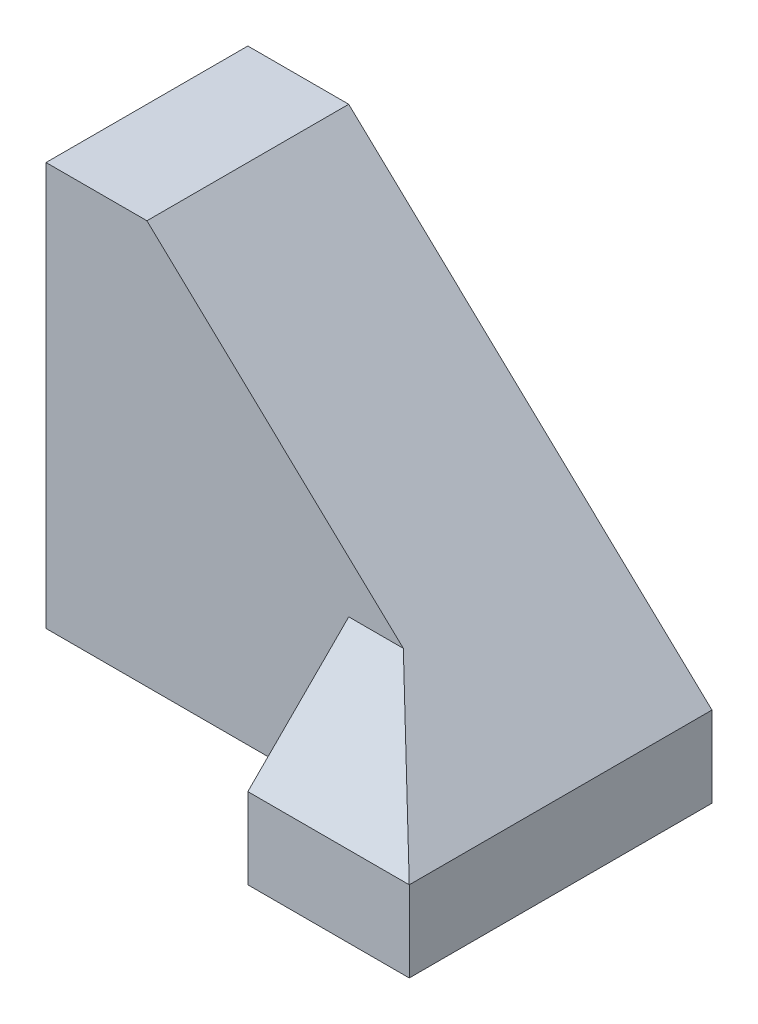
ISO-10303-21;
HEADER;
FILE_DESCRIPTION(('STEP AP214'),'2;1');
FILE_NAME('part.step','',(''),(''),'','','');
FILE_SCHEMA(('AUTOMOTIVE_DESIGN { 1 0 10303 214 1 1 1 1 }'));
ENDSEC;
DATA;
#1=APPLICATION_CONTEXT('core data for automotive mechanical design processes');
#2=APPLICATION_PROTOCOL_DEFINITION('international standard','automotive_design',2000,#1);
#3=PRODUCT_CONTEXT('',#1,'mechanical');
#4=PRODUCT('Part','Part','',(#3));
#5=PRODUCT_RELATED_PRODUCT_CATEGORY('part','',(#4));
#6=PRODUCT_DEFINITION_FORMATION('','',#4);
#7=PRODUCT_DEFINITION_CONTEXT('part definition',#1,'design');
#8=PRODUCT_DEFINITION('design','',#6,#7);
#9=PRODUCT_DEFINITION_SHAPE('','',#8);
#10=(LENGTH_UNIT() NAMED_UNIT(*) SI_UNIT(.MILLI.,.METRE.));
#11=(NAMED_UNIT(*) PLANE_ANGLE_UNIT() SI_UNIT($,.RADIAN.));
#12=(NAMED_UNIT(*) SI_UNIT($,.STERADIAN.) SOLID_ANGLE_UNIT());
#13=UNCERTAINTY_MEASURE_WITH_UNIT(LENGTH_MEASURE(1.E-05),#10,'distance_accuracy_value','');
#14=(GEOMETRIC_REPRESENTATION_CONTEXT(3) GLOBAL_UNCERTAINTY_ASSIGNED_CONTEXT((#13)) GLOBAL_UNIT_ASSIGNED_CONTEXT((#10,
#11,#12)) REPRESENTATION_CONTEXT('',''));
#15=CARTESIAN_POINT('',(0.,0.,0.));
#16=DIRECTION('',(0.,0.,1.));
#17=DIRECTION('',(1.,0.,0.));
#18=AXIS2_PLACEMENT_3D('',#15,#16,#17);
#19=CARTESIAN_POINT('',(23.,0.,10.));
#20=DIRECTION('',(0.,1.,0.));
#21=DIRECTION('',(-1.,0.,0.));
#22=AXIS2_PLACEMENT_3D('',#19,#20,#21);
#23=PLANE('',#22);
#24=DIRECTION('',(0.,0.,-1.));
#25=VECTOR('',#24,1.);
#26=CARTESIAN_POINT('',(15.,0.,15.));
#27=LINE('',#26,#25);
#28=CARTESIAN_POINT('',(15.,0.,10.));
#29=VERTEX_POINT('',#28);
#30=CARTESIAN_POINT('',(15.,0.,0.));
#31=VERTEX_POINT('',#30);
#32=EDGE_CURVE('E11',#29,#31,#27,.T.);
#33=ORIENTED_EDGE('',*,*,#32,.F.);
#34=DIRECTION('',(1.,0.,0.));
#35=VECTOR('',#34,1.);
#36=CARTESIAN_POINT('',(23.,0.,10.));
#37=LINE('',#36,#35);
#38=CARTESIAN_POINT('',(0.,0.,10.));
#39=VERTEX_POINT('',#38);
#40=EDGE_CURVE('E152',#39,#29,#37,.T.);
#41=ORIENTED_EDGE('',*,*,#40,.F.);
#42=DIRECTION('',(0.,0.,-1.));
#43=VECTOR('',#42,1.);
#44=CARTESIAN_POINT('',(0.,0.,10.));
#45=LINE('',#44,#43);
#46=CARTESIAN_POINT('',(0.,0.,0.));
#47=VERTEX_POINT('',#46);
#48=EDGE_CURVE('E161',#39,#47,#45,.T.);
#49=ORIENTED_EDGE('',*,*,#48,.T.);
#50=DIRECTION('',(1.,0.,0.));
#51=VECTOR('',#50,1.);
#52=CARTESIAN_POINT('',(23.,0.,0.));
#53=LINE('',#52,#51);
#54=EDGE_CURVE('E143',#47,#31,#53,.T.);
#55=ORIENTED_EDGE('',*,*,#54,.T.);
#56=EDGE_LOOP('',(#33,#41,#49,#55));
#57=FACE_BOUND('',#56,.T.);
#58=ADVANCED_FACE('F34',(#57),#23,.F.);
#59=CARTESIAN_POINT('',(0.,0.,10.));
#60=DIRECTION('',(0.,0.,-1.));
#61=DIRECTION('',(-1.,0.,0.));
#62=AXIS2_PLACEMENT_3D('',#59,#60,#61);
#63=PLANE('',#62);
#64=DIRECTION('',(0.,-1.,0.));
#65=VECTOR('',#64,1.);
#66=CARTESIAN_POINT('',(15.,0.,10.));
#67=LINE('',#66,#65);
#68=CARTESIAN_POINT('',(15.,8.00000000000004,10.));
#69=VERTEX_POINT('',#68);
#70=EDGE_CURVE('E59',#69,#29,#67,.T.);
#71=ORIENTED_EDGE('',*,*,#70,.F.);
#72=DIRECTION('',(1.,0.,0.));
#73=VECTOR('',#72,1.);
#74=CARTESIAN_POINT('',(23.,8.00000000000004,10.));
#75=LINE('',#74,#73);
#76=CARTESIAN_POINT('',(17.7058823529411,8.00000000000004,10.));
#77=VERTEX_POINT('',#76);
#78=EDGE_CURVE('E178',#69,#77,#75,.T.);
#79=ORIENTED_EDGE('',*,*,#78,.T.);
#80=DIRECTION('',(-0.727013152549817,0.686623532963716,0.));
#81=VECTOR('',#80,1.);
#82=CARTESIAN_POINT('',(5.,20.,10.));
#83=LINE('',#82,#81);
#84=CARTESIAN_POINT('',(5.,20.,10.));
#85=VERTEX_POINT('',#84);
#86=EDGE_CURVE('E154',#77,#85,#83,.T.);
#87=ORIENTED_EDGE('',*,*,#86,.T.);
#88=DIRECTION('',(-1.,0.,0.));
#89=VECTOR('',#88,1.);
#90=CARTESIAN_POINT('',(0.,20.,10.));
#91=LINE('',#90,#89);
#92=CARTESIAN_POINT('',(0.,20.,10.));
#93=VERTEX_POINT('',#92);
#94=EDGE_CURVE('E157',#85,#93,#91,.T.);
#95=ORIENTED_EDGE('',*,*,#94,.T.);
#96=DIRECTION('',(0.,-1.,0.));
#97=VECTOR('',#96,1.);
#98=CARTESIAN_POINT('',(0.,0.,10.));
#99=LINE('',#98,#97);
#100=EDGE_CURVE('E159',#93,#39,#99,.T.);
#101=ORIENTED_EDGE('',*,*,#100,.T.);
#102=ORIENTED_EDGE('',*,*,#40,.T.);
#103=EDGE_LOOP('',(#71,#79,#87,#95,#101,#102));
#104=FACE_BOUND('',#103,.T.);
#105=ADVANCED_FACE('F194',(#104),#63,.F.);
#106=CARTESIAN_POINT('',(23.,3.,10.));
#107=DIRECTION('',(-1.,0.,0.));
#108=DIRECTION('',(0.,0.,1.));
#109=AXIS2_PLACEMENT_3D('',#106,#107,#108);
#110=PLANE('',#109);
#111=DIRECTION('',(0.,1.,0.));
#112=VECTOR('',#111,1.);
#113=CARTESIAN_POINT('',(23.,3.,0.));
#114=LINE('',#113,#112);
#115=CARTESIAN_POINT('',(23.,-1.,0.));
#116=VERTEX_POINT('',#115);
#117=CARTESIAN_POINT('',(23.,3.,0.));
#118=VERTEX_POINT('',#117);
#119=EDGE_CURVE('E112',#116,#118,#114,.T.);
#120=ORIENTED_EDGE('',*,*,#119,.T.);
#121=DIRECTION('',(0.,0.,-1.));
#122=VECTOR('',#121,1.);
#123=CARTESIAN_POINT('',(23.,3.,10.));
#124=LINE('',#123,#122);
#125=CARTESIAN_POINT('',(23.,3.,15.));
#126=VERTEX_POINT('',#125);
#127=EDGE_CURVE('E51',#126,#118,#124,.T.);
#128=ORIENTED_EDGE('',*,*,#127,.F.);
#129=DIRECTION('',(0.,1.,0.));
#130=VECTOR('',#129,1.);
#131=CARTESIAN_POINT('',(23.,0.,15.));
#132=LINE('',#131,#130);
#133=CARTESIAN_POINT('',(23.,-1.,15.));
#134=VERTEX_POINT('',#133);
#135=EDGE_CURVE('E134',#134,#126,#132,.T.);
#136=ORIENTED_EDGE('',*,*,#135,.F.);
#137=DIRECTION('',(0.,0.,1.));
#138=VECTOR('',#137,1.);
#139=CARTESIAN_POINT('',(23.,-1.,15.));
#140=LINE('',#139,#138);
#141=EDGE_CURVE('E116',#116,#134,#140,.T.);
#142=ORIENTED_EDGE('',*,*,#141,.F.);
#143=EDGE_LOOP('',(#120,#128,#136,#142));
#144=FACE_BOUND('',#143,.T.);
#145=ADVANCED_FACE('F191',(#144),#110,.F.);
#146=CARTESIAN_POINT('',(5.,20.,10.));
#147=DIRECTION('',(-0.686623532963717,-0.727013152549817,0.));
#148=DIRECTION('',(0.727013152549817,-0.686623532963717,0.));
#149=AXIS2_PLACEMENT_3D('',#146,#147,#148);
#150=PLANE('',#149);
#151=DIRECTION('',(-0.727013152549817,0.686623532963716,0.));
#152=VECTOR('',#151,1.);
#153=CARTESIAN_POINT('',(5.,20.,0.));
#154=LINE('',#153,#152);
#155=CARTESIAN_POINT('',(5.,20.,0.));
#156=VERTEX_POINT('',#155);
#157=EDGE_CURVE('E164',#118,#156,#154,.T.);
#158=ORIENTED_EDGE('',*,*,#157,.T.);
#159=DIRECTION('',(0.,0.,-1.));
#160=VECTOR('',#159,1.);
#161=CARTESIAN_POINT('',(5.,20.,10.));
#162=LINE('',#161,#160);
#163=EDGE_CURVE('E174',#85,#156,#162,.T.);
#164=ORIENTED_EDGE('',*,*,#163,.F.);
#165=ORIENTED_EDGE('',*,*,#86,.F.);
#166=DIRECTION('',(-0.599334442390825,0.566038084480224,-0.56603808448022));
#167=VECTOR('',#166,1.);
#168=CARTESIAN_POINT('',(9.07095343680704,16.1552106430156,1.84478935698452));
#169=LINE('',#168,#167);
#170=EDGE_CURVE('E39',#77,#126,#169,.F.);
#171=ORIENTED_EDGE('',*,*,#170,.T.);
#172=ORIENTED_EDGE('',*,*,#127,.T.);
#173=EDGE_LOOP('',(#158,#164,#165,#171,#172));
#174=FACE_BOUND('',#173,.T.);
#175=ADVANCED_FACE('F186',(#174),#150,.F.);
#176=CARTESIAN_POINT('',(0.,20.,10.));
#177=DIRECTION('',(0.,-1.,0.));
#178=DIRECTION('',(0.,0.,-1.));
#179=AXIS2_PLACEMENT_3D('',#176,#177,#178);
#180=PLANE('',#179);
#181=DIRECTION('',(-1.,0.,0.));
#182=VECTOR('',#181,1.);
#183=CARTESIAN_POINT('',(0.,20.,0.));
#184=LINE('',#183,#182);
#185=CARTESIAN_POINT('',(0.,20.,0.));
#186=VERTEX_POINT('',#185);
#187=EDGE_CURVE('E166',#156,#186,#184,.T.);
#188=ORIENTED_EDGE('',*,*,#187,.T.);
#189=DIRECTION('',(0.,0.,-1.));
#190=VECTOR('',#189,1.);
#191=CARTESIAN_POINT('',(0.,20.,10.));
#192=LINE('',#191,#190);
#193=EDGE_CURVE('E171',#93,#186,#192,.T.);
#194=ORIENTED_EDGE('',*,*,#193,.F.);
#195=ORIENTED_EDGE('',*,*,#94,.F.);
#196=ORIENTED_EDGE('',*,*,#163,.T.);
#197=EDGE_LOOP('',(#188,#194,#195,#196));
#198=FACE_BOUND('',#197,.T.);
#199=ADVANCED_FACE('F200',(#198),#180,.F.);
#200=CARTESIAN_POINT('',(0.,0.,10.));
#201=DIRECTION('',(1.,0.,0.));
#202=DIRECTION('',(0.,0.,-1.));
#203=AXIS2_PLACEMENT_3D('',#200,#201,#202);
#204=PLANE('',#203);
#205=CARTESIAN_POINT('',(0.,15.,5.));
#206=DIRECTION('',(-1.,0.,0.));
#207=DIRECTION('',(0.,0.,1.));
#208=AXIS2_PLACEMENT_3D('',#205,#206,#207);
#209=CIRCLE('',#208,1.85);
#210=CARTESIAN_POINT('',(0.,15.,6.85));
#211=VERTEX_POINT('',#210);
#212=EDGE_CURVE('E144',#211,#211,#209,.T.);
#213=ORIENTED_EDGE('',*,*,#212,.F.);
#214=EDGE_LOOP('',(#213));
#215=FACE_BOUND('',#214,.T.);
#216=CARTESIAN_POINT('',(0.,5.,5.));
#217=DIRECTION('',(-1.,0.,0.));
#218=DIRECTION('',(0.,0.,1.));
#219=AXIS2_PLACEMENT_3D('',#216,#217,#218);
#220=CIRCLE('',#219,1.85);
#221=CARTESIAN_POINT('',(0.,5.,6.85));
#222=VERTEX_POINT('',#221);
#223=EDGE_CURVE('E138',#222,#222,#220,.T.);
#224=ORIENTED_EDGE('',*,*,#223,.F.);
#225=EDGE_LOOP('',(#224));
#226=FACE_BOUND('',#225,.T.);
#227=DIRECTION('',(0.,-1.,0.));
#228=VECTOR('',#227,1.);
#229=CARTESIAN_POINT('',(0.,0.,0.));
#230=LINE('',#229,#228);
#231=EDGE_CURVE('E155',#186,#47,#230,.T.);
#232=ORIENTED_EDGE('',*,*,#231,.T.);
#233=ORIENTED_EDGE('',*,*,#48,.F.);
#234=ORIENTED_EDGE('',*,*,#100,.F.);
#235=ORIENTED_EDGE('',*,*,#193,.T.);
#236=EDGE_LOOP('',(#232,#233,#234,#235));
#237=FACE_BOUND('',#236,.T.);
#238=ADVANCED_FACE('F213',(#215,#226,#237),#204,.F.);
#239=CARTESIAN_POINT('',(0.,0.,0.));
#240=DIRECTION('',(0.,0.,-1.));
#241=DIRECTION('',(-1.,0.,0.));
#242=AXIS2_PLACEMENT_3D('',#239,#240,#241);
#243=PLANE('',#242);
#244=ORIENTED_EDGE('',*,*,#54,.F.);
#245=ORIENTED_EDGE('',*,*,#231,.F.);
#246=ORIENTED_EDGE('',*,*,#187,.F.);
#247=ORIENTED_EDGE('',*,*,#157,.F.);
#248=ORIENTED_EDGE('',*,*,#119,.F.);
#249=DIRECTION('',(1.,0.,0.));
#250=VECTOR('',#249,1.);
#251=CARTESIAN_POINT('',(15.,-1.,0.));
#252=LINE('',#251,#250);
#253=CARTESIAN_POINT('',(15.,-1.,0.));
#254=VERTEX_POINT('',#253);
#255=EDGE_CURVE('E105',#254,#116,#252,.T.);
#256=ORIENTED_EDGE('',*,*,#255,.F.);
#257=DIRECTION('',(0.,1.,0.));
#258=VECTOR('',#257,1.);
#259=CARTESIAN_POINT('',(15.,-1.,0.));
#260=LINE('',#259,#258);
#261=EDGE_CURVE('E110',#254,#31,#260,.T.);
#262=ORIENTED_EDGE('',*,*,#261,.T.);
#263=EDGE_LOOP('',(#244,#245,#246,#247,#248,#256,#262));
#264=FACE_BOUND('',#263,.T.);
#265=ADVANCED_FACE('F108',(#264),#243,.T.);
#266=CARTESIAN_POINT('',(6.,5.,5.));
#267=DIRECTION('',(-1.,0.,0.));
#268=DIRECTION('',(0.,0.,1.));
#269=AXIS2_PLACEMENT_3D('',#266,#267,#268);
#270=CYLINDRICAL_SURFACE('',#269,1.85);
#271=CARTESIAN_POINT('',(6.,5.,5.));
#272=DIRECTION('',(-1.,0.,0.));
#273=DIRECTION('',(0.,0.,1.));
#274=AXIS2_PLACEMENT_3D('',#271,#272,#273);
#275=CIRCLE('',#274,1.85);
#276=CARTESIAN_POINT('',(6.,5.,6.85));
#277=VERTEX_POINT('',#276);
#278=EDGE_CURVE('E147',#277,#277,#275,.T.);
#279=ORIENTED_EDGE('',*,*,#278,.F.);
#280=EDGE_LOOP('',(#279));
#281=FACE_BOUND('',#280,.T.);
#282=ORIENTED_EDGE('',*,*,#223,.T.);
#283=EDGE_LOOP('',(#282));
#284=FACE_BOUND('',#283,.T.);
#285=ADVANCED_FACE('F226',(#281,#284),#270,.F.);
#286=CARTESIAN_POINT('',(6.,5.,5.));
#287=DIRECTION('',(-1.,0.,0.));
#288=DIRECTION('',(0.,0.,1.));
#289=AXIS2_PLACEMENT_3D('',#286,#287,#288);
#290=PLANE('',#289);
#291=ORIENTED_EDGE('',*,*,#278,.T.);
#292=EDGE_LOOP('',(#291));
#293=FACE_BOUND('',#292,.T.);
#294=ADVANCED_FACE('F230',(#293),#290,.T.);
#295=CARTESIAN_POINT('',(6.,15.,5.));
#296=DIRECTION('',(-1.,0.,0.));
#297=DIRECTION('',(0.,0.,1.));
#298=AXIS2_PLACEMENT_3D('',#295,#296,#297);
#299=CYLINDRICAL_SURFACE('',#298,1.85);
#300=CARTESIAN_POINT('',(6.,15.,5.));
#301=DIRECTION('',(-1.,0.,0.));
#302=DIRECTION('',(0.,0.,1.));
#303=AXIS2_PLACEMENT_3D('',#300,#301,#302);
#304=CIRCLE('',#303,1.85);
#305=CARTESIAN_POINT('',(6.,15.,6.85));
#306=VERTEX_POINT('',#305);
#307=EDGE_CURVE('E140',#306,#306,#304,.T.);
#308=ORIENTED_EDGE('',*,*,#307,.F.);
#309=EDGE_LOOP('',(#308));
#310=FACE_BOUND('',#309,.T.);
#311=ORIENTED_EDGE('',*,*,#212,.T.);
#312=EDGE_LOOP('',(#311));
#313=FACE_BOUND('',#312,.T.);
#314=ADVANCED_FACE('F234',(#310,#313),#299,.F.);
#315=CARTESIAN_POINT('',(6.,15.,5.));
#316=DIRECTION('',(-1.,0.,0.));
#317=DIRECTION('',(0.,0.,1.));
#318=AXIS2_PLACEMENT_3D('',#315,#316,#317);
#319=PLANE('',#318);
#320=ORIENTED_EDGE('',*,*,#307,.T.);
#321=EDGE_LOOP('',(#320));
#322=FACE_BOUND('',#321,.T.);
#323=ADVANCED_FACE('F238',(#322),#319,.T.);
#324=CARTESIAN_POINT('',(15.,0.,15.));
#325=DIRECTION('',(1.,0.,0.));
#326=DIRECTION('',(0.,0.,-1.));
#327=AXIS2_PLACEMENT_3D('',#324,#325,#326);
#328=PLANE('',#327);
#329=ORIENTED_EDGE('',*,*,#70,.T.);
#330=ORIENTED_EDGE('',*,*,#32,.T.);
#331=ORIENTED_EDGE('',*,*,#261,.F.);
#332=DIRECTION('',(0.,0.,-1.));
#333=VECTOR('',#332,1.);
#334=CARTESIAN_POINT('',(15.,-1.,15.));
#335=LINE('',#334,#333);
#336=CARTESIAN_POINT('',(15.,-1.,15.));
#337=VERTEX_POINT('',#336);
#338=EDGE_CURVE('E117',#337,#254,#335,.T.);
#339=ORIENTED_EDGE('',*,*,#338,.F.);
#340=DIRECTION('',(0.,-1.,0.));
#341=VECTOR('',#340,1.);
#342=CARTESIAN_POINT('',(15.,0.,15.));
#343=LINE('',#342,#341);
#344=CARTESIAN_POINT('',(15.,3.,15.));
#345=VERTEX_POINT('',#344);
#346=EDGE_CURVE('E129',#345,#337,#343,.T.);
#347=ORIENTED_EDGE('',*,*,#346,.F.);
#348=DIRECTION('',(0.,-0.70710678118655,0.707106781186545));
#349=VECTOR('',#348,1.);
#350=CARTESIAN_POINT('',(15.,1.49999999999999,16.5));
#351=LINE('',#350,#349);
#352=EDGE_CURVE('E179',#345,#69,#351,.F.);
#353=ORIENTED_EDGE('',*,*,#352,.T.);
#354=EDGE_LOOP('',(#329,#330,#331,#339,#347,#353));
#355=FACE_BOUND('',#354,.T.);
#356=ADVANCED_FACE('F127',(#355),#328,.F.);
#357=CARTESIAN_POINT('',(0.,0.,15.));
#358=DIRECTION('',(0.,0.,-1.));
#359=DIRECTION('',(-1.,0.,0.));
#360=AXIS2_PLACEMENT_3D('',#357,#358,#359);
#361=PLANE('',#360);
#362=ORIENTED_EDGE('',*,*,#346,.T.);
#363=DIRECTION('',(-1.,0.,0.));
#364=VECTOR('',#363,1.);
#365=CARTESIAN_POINT('',(15.,-1.,15.));
#366=LINE('',#365,#364);
#367=EDGE_CURVE('E123',#134,#337,#366,.T.);
#368=ORIENTED_EDGE('',*,*,#367,.F.);
#369=ORIENTED_EDGE('',*,*,#135,.T.);
#370=DIRECTION('',(-1.,0.,0.));
#371=VECTOR('',#370,1.);
#372=CARTESIAN_POINT('',(15.,3.,15.));
#373=LINE('',#372,#371);
#374=EDGE_CURVE('E136',#126,#345,#373,.T.);
#375=ORIENTED_EDGE('',*,*,#374,.T.);
#376=EDGE_LOOP('',(#362,#368,#369,#375));
#377=FACE_BOUND('',#376,.T.);
#378=ADVANCED_FACE('F190',(#377),#361,.F.);
#379=CARTESIAN_POINT('',(15.,3.,15.));
#380=DIRECTION('',(0.,0.707106781186545,0.70710678118655));
#381=DIRECTION('',(1.,0.,0.));
#382=AXIS2_PLACEMENT_3D('',#379,#380,#381);
#383=PLANE('',#382);
#384=ORIENTED_EDGE('',*,*,#170,.F.);
#385=ORIENTED_EDGE('',*,*,#78,.F.);
#386=ORIENTED_EDGE('',*,*,#352,.F.);
#387=ORIENTED_EDGE('',*,*,#374,.F.);
#388=EDGE_LOOP('',(#384,#385,#386,#387));
#389=FACE_BOUND('',#388,.T.);
#390=ADVANCED_FACE('F37',(#389),#383,.T.);
#391=CARTESIAN_POINT('',(0.,-1.,0.));
#392=DIRECTION('',(0.,-1.,0.));
#393=DIRECTION('',(1.,0.,0.));
#394=AXIS2_PLACEMENT_3D('',#391,#392,#393);
#395=PLANE('',#394);
#396=ORIENTED_EDGE('',*,*,#338,.T.);
#397=ORIENTED_EDGE('',*,*,#255,.T.);
#398=ORIENTED_EDGE('',*,*,#141,.T.);
#399=ORIENTED_EDGE('',*,*,#367,.T.);
#400=EDGE_LOOP('',(#396,#397,#398,#399));
#401=FACE_BOUND('',#400,.T.);
#402=ADVANCED_FACE('F121',(#401),#395,.T.);
#403=CLOSED_SHELL('',(#58,#105,#145,#175,#199,#238,#265,#285,#294,#314,#323,#356,#378,#390,#402));
#404=MANIFOLD_SOLID_BREP('B2',#403);
#405=ADVANCED_BREP_SHAPE_REPRESENTATION('',(#18,#404),#14);
#406=SHAPE_DEFINITION_REPRESENTATION(#9,#405);
ENDSEC;
END-ISO-10303-21;
